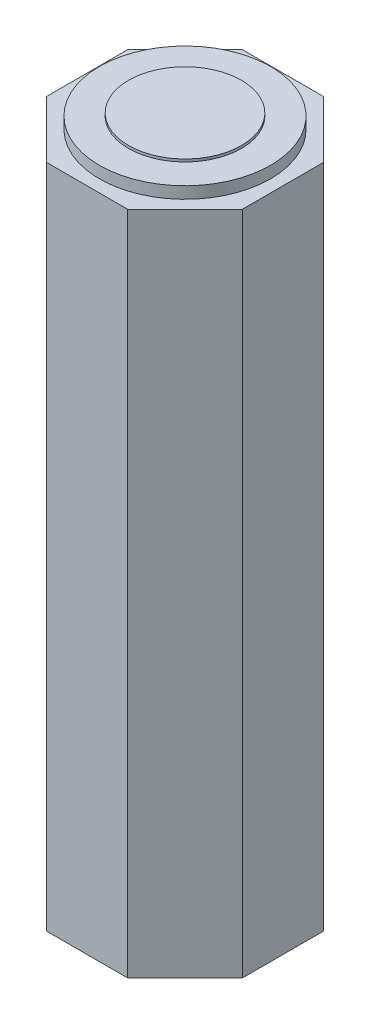
ISO-10303-21;
HEADER;
FILE_DESCRIPTION(('STEP AP214'),'2;1');
FILE_NAME('part.step','',(''),(''),'','','');
FILE_SCHEMA(('AUTOMOTIVE_DESIGN { 1 0 10303 214 1 1 1 1 }'));
ENDSEC;
DATA;
#1=APPLICATION_CONTEXT('core data for automotive mechanical design processes');
#2=APPLICATION_PROTOCOL_DEFINITION('international standard','automotive_design',2000,#1);
#3=PRODUCT_CONTEXT('',#1,'mechanical');
#4=PRODUCT('Part','Part','',(#3));
#5=PRODUCT_RELATED_PRODUCT_CATEGORY('part','',(#4));
#6=PRODUCT_DEFINITION_FORMATION('','',#4);
#7=PRODUCT_DEFINITION_CONTEXT('part definition',#1,'design');
#8=PRODUCT_DEFINITION('design','',#6,#7);
#9=PRODUCT_DEFINITION_SHAPE('','',#8);
#10=(LENGTH_UNIT() NAMED_UNIT(*) SI_UNIT(.MILLI.,.METRE.));
#11=(NAMED_UNIT(*) PLANE_ANGLE_UNIT() SI_UNIT($,.RADIAN.));
#12=(NAMED_UNIT(*) SI_UNIT($,.STERADIAN.) SOLID_ANGLE_UNIT());
#13=UNCERTAINTY_MEASURE_WITH_UNIT(LENGTH_MEASURE(1.E-05),#10,'distance_accuracy_value','');
#14=(GEOMETRIC_REPRESENTATION_CONTEXT(3) GLOBAL_UNCERTAINTY_ASSIGNED_CONTEXT((#13)) GLOBAL_UNIT_ASSIGNED_CONTEXT((#10,
#11,#12)) REPRESENTATION_CONTEXT('',''));
#15=CARTESIAN_POINT('',(0.,0.,0.));
#16=DIRECTION('',(0.,0.,1.));
#17=DIRECTION('',(1.,0.,0.));
#18=AXIS2_PLACEMENT_3D('',#15,#16,#17);
#19=CARTESIAN_POINT('',(850.,-323.,1050.));
#20=DIRECTION('',(0.,1.,0.));
#21=DIRECTION('',(-1.,0.,0.));
#22=AXIS2_PLACEMENT_3D('',#19,#20,#21);
#23=CYLINDRICAL_SURFACE('',#22,197.);
#24=CARTESIAN_POINT('',(850.,-225.,1050.));
#25=DIRECTION('',(0.,1.,0.));
#26=DIRECTION('',(-1.,0.,0.));
#27=AXIS2_PLACEMENT_3D('',#24,#25,#26);
#28=CIRCLE('',#27,197.);
#29=CARTESIAN_POINT('',(653.,-225.,1050.));
#30=VERTEX_POINT('',#29);
#31=EDGE_CURVE('E21',#30,#30,#28,.T.);
#32=ORIENTED_EDGE('',*,*,#31,.T.);
#33=EDGE_LOOP('',(#32));
#34=FACE_BOUND('',#33,.T.);
#35=CARTESIAN_POINT('',(850.,-198.,1050.));
#36=DIRECTION('',(0.,-1.,0.));
#37=DIRECTION('',(0.,0.,1.));
#38=AXIS2_PLACEMENT_3D('',#35,#36,#37);
#39=CIRCLE('',#38,197.);
#40=CARTESIAN_POINT('',(850.,-198.,1247.));
#41=VERTEX_POINT('',#40);
#42=EDGE_CURVE('E113',#41,#41,#39,.T.);
#43=ORIENTED_EDGE('',*,*,#42,.T.);
#44=EDGE_LOOP('',(#43));
#45=FACE_BOUND('',#44,.T.);
#46=ADVANCED_FACE('F17',(#34,#45),#23,.T.);
#47=CARTESIAN_POINT('',(850.,-198.,1050.));
#48=DIRECTION('',(0.,1.,0.));
#49=DIRECTION('',(-1.,0.,0.));
#50=AXIS2_PLACEMENT_3D('',#47,#48,#49);
#51=CYLINDRICAL_SURFACE('',#50,130.);
#52=CARTESIAN_POINT('',(850.,-198.,1050.));
#53=DIRECTION('',(0.,-1.,0.));
#54=DIRECTION('',(0.,0.,1.));
#55=AXIS2_PLACEMENT_3D('',#52,#53,#54);
#56=CIRCLE('',#55,130.);
#57=CARTESIAN_POINT('',(850.,-198.,1180.));
#58=VERTEX_POINT('',#57);
#59=EDGE_CURVE('E116',#58,#58,#56,.T.);
#60=ORIENTED_EDGE('',*,*,#59,.F.);
#61=EDGE_LOOP('',(#60));
#62=FACE_BOUND('',#61,.T.);
#63=CARTESIAN_POINT('',(850.,-192.,1050.));
#64=DIRECTION('',(0.,-1.,0.));
#65=DIRECTION('',(1.,0.,0.));
#66=AXIS2_PLACEMENT_3D('',#63,#64,#65);
#67=CIRCLE('',#66,130.);
#68=CARTESIAN_POINT('',(980.,-192.,1050.));
#69=VERTEX_POINT('',#68);
#70=EDGE_CURVE('E108',#69,#69,#67,.T.);
#71=ORIENTED_EDGE('',*,*,#70,.T.);
#72=EDGE_LOOP('',(#71));
#73=FACE_BOUND('',#72,.T.);
#74=ADVANCED_FACE('F185',(#62,#73),#51,.T.);
#75=CARTESIAN_POINT('',(850.,-198.,1050.));
#76=DIRECTION('',(0.,-1.,0.));
#77=DIRECTION('',(1.,0.,0.));
#78=AXIS2_PLACEMENT_3D('',#75,#76,#77);
#79=PLANE('',#78);
#80=ORIENTED_EDGE('',*,*,#59,.T.);
#81=EDGE_LOOP('',(#80));
#82=FACE_BOUND('',#81,.T.);
#83=ORIENTED_EDGE('',*,*,#42,.F.);
#84=EDGE_LOOP('',(#83));
#85=FACE_BOUND('',#84,.T.);
#86=ADVANCED_FACE('F191',(#82,#85),#79,.F.);
#87=CARTESIAN_POINT('',(850.,-192.,1050.));
#88=DIRECTION('',(0.,-1.,0.));
#89=DIRECTION('',(1.,0.,0.));
#90=AXIS2_PLACEMENT_3D('',#87,#88,#89);
#91=PLANE('',#90);
#92=ORIENTED_EDGE('',*,*,#70,.F.);
#93=EDGE_LOOP('',(#92));
#94=FACE_BOUND('',#93,.T.);
#95=ADVANCED_FACE('F196',(#94),#91,.F.);
#96=CARTESIAN_POINT('',(850.,-225.,1050.));
#97=DIRECTION('',(0.,1.,0.));
#98=DIRECTION('',(0.,0.,-1.));
#99=AXIS2_PLACEMENT_3D('',#96,#97,#98);
#100=PLANE('',#99);
#101=DIRECTION('',(0.,0.,1.));
#102=VECTOR('',#101,1.);
#103=CARTESIAN_POINT('',(1075.,-225.,956.801948466053));
#104=LINE('',#103,#102);
#105=CARTESIAN_POINT('',(1075.,-225.,956.801948466053));
#106=VERTEX_POINT('',#105);
#107=CARTESIAN_POINT('',(1075.,-225.,1143.19805153395));
#108=VERTEX_POINT('',#107);
#109=EDGE_CURVE('E86',#106,#108,#104,.T.);
#110=ORIENTED_EDGE('',*,*,#109,.F.);
#111=DIRECTION('',(0.707106781186548,0.,0.707106781186547));
#112=VECTOR('',#111,1.);
#113=CARTESIAN_POINT('',(943.198051533946,-225.,825.));
#114=LINE('',#113,#112);
#115=CARTESIAN_POINT('',(943.198051533946,-225.,825.));
#116=VERTEX_POINT('',#115);
#117=EDGE_CURVE('E93',#116,#106,#114,.T.);
#118=ORIENTED_EDGE('',*,*,#117,.F.);
#119=DIRECTION('',(1.,0.,0.));
#120=VECTOR('',#119,1.);
#121=CARTESIAN_POINT('',(756.801948466054,-225.,825.));
#122=LINE('',#121,#120);
#123=CARTESIAN_POINT('',(756.801948466054,-225.,825.));
#124=VERTEX_POINT('',#123);
#125=EDGE_CURVE('E98',#124,#116,#122,.T.);
#126=ORIENTED_EDGE('',*,*,#125,.F.);
#127=DIRECTION('',(0.707106781186547,0.,-0.707106781186548));
#128=VECTOR('',#127,1.);
#129=CARTESIAN_POINT('',(625.,-225.,956.801948466053));
#130=LINE('',#129,#128);
#131=CARTESIAN_POINT('',(625.,-225.,956.801948466053));
#132=VERTEX_POINT('',#131);
#133=EDGE_CURVE('E150',#132,#124,#130,.T.);
#134=ORIENTED_EDGE('',*,*,#133,.F.);
#135=DIRECTION('',(0.,0.,-1.));
#136=VECTOR('',#135,1.);
#137=CARTESIAN_POINT('',(625.,-225.,1143.19805153395));
#138=LINE('',#137,#136);
#139=CARTESIAN_POINT('',(625.,-225.,1143.19805153395));
#140=VERTEX_POINT('',#139);
#141=EDGE_CURVE('E167',#140,#132,#138,.T.);
#142=ORIENTED_EDGE('',*,*,#141,.F.);
#143=DIRECTION('',(-0.707106781186547,0.,-0.707106781186548));
#144=VECTOR('',#143,1.);
#145=CARTESIAN_POINT('',(756.801948466054,-225.,1275.));
#146=LINE('',#145,#144);
#147=CARTESIAN_POINT('',(756.801948466054,-225.,1275.));
#148=VERTEX_POINT('',#147);
#149=EDGE_CURVE('E165',#148,#140,#146,.T.);
#150=ORIENTED_EDGE('',*,*,#149,.F.);
#151=DIRECTION('',(-1.,0.,0.));
#152=VECTOR('',#151,1.);
#153=CARTESIAN_POINT('',(943.198051533946,-225.,1275.));
#154=LINE('',#153,#152);
#155=CARTESIAN_POINT('',(943.198051533946,-225.,1275.));
#156=VERTEX_POINT('',#155);
#157=EDGE_CURVE('E168',#156,#148,#154,.T.);
#158=ORIENTED_EDGE('',*,*,#157,.F.);
#159=DIRECTION('',(-0.707106781186549,0.,0.707106781186547));
#160=VECTOR('',#159,1.);
#161=CARTESIAN_POINT('',(1075.,-225.,1143.19805153395));
#162=LINE('',#161,#160);
#163=EDGE_CURVE('E105',#108,#156,#162,.T.);
#164=ORIENTED_EDGE('',*,*,#163,.F.);
#165=EDGE_LOOP('',(#110,#118,#126,#134,#142,#150,#158,#164));
#166=FACE_BOUND('',#165,.T.);
#167=ORIENTED_EDGE('',*,*,#31,.F.);
#168=EDGE_LOOP('',(#167));
#169=FACE_BOUND('',#168,.T.);
#170=ADVANCED_FACE('F101',(#166,#169),#100,.T.);
#171=CARTESIAN_POINT('',(850.,-1757.,1050.));
#172=DIRECTION('',(0.,-1.,0.));
#173=DIRECTION('',(1.,0.,0.));
#174=AXIS2_PLACEMENT_3D('',#171,#172,#173);
#175=PLANE('',#174);
#176=DIRECTION('',(-0.707106781186548,0.,-0.707106781186548));
#177=VECTOR('',#176,1.);
#178=CARTESIAN_POINT('',(1009.09902576697,-1757.,890.900974233027));
#179=LINE('',#178,#177);
#180=CARTESIAN_POINT('',(1075.,-1757.,956.801948466054));
#181=VERTEX_POINT('',#180);
#182=CARTESIAN_POINT('',(943.198051533946,-1757.,825.));
#183=VERTEX_POINT('',#182);
#184=EDGE_CURVE('E90',#181,#183,#179,.T.);
#185=ORIENTED_EDGE('',*,*,#184,.F.);
#186=DIRECTION('',(0.,0.,-1.));
#187=VECTOR('',#186,1.);
#188=CARTESIAN_POINT('',(1075.,-1757.,1050.));
#189=LINE('',#188,#187);
#190=CARTESIAN_POINT('',(1075.,-1757.,1143.19805153395));
#191=VERTEX_POINT('',#190);
#192=EDGE_CURVE('E88',#191,#181,#189,.T.);
#193=ORIENTED_EDGE('',*,*,#192,.F.);
#194=DIRECTION('',(0.707106781186548,0.,-0.707106781186547));
#195=VECTOR('',#194,1.);
#196=CARTESIAN_POINT('',(1009.09902576697,-1757.,1209.09902576697));
#197=LINE('',#196,#195);
#198=CARTESIAN_POINT('',(943.198051533946,-1757.,1275.));
#199=VERTEX_POINT('',#198);
#200=EDGE_CURVE('E41',#199,#191,#197,.T.);
#201=ORIENTED_EDGE('',*,*,#200,.F.);
#202=DIRECTION('',(1.,0.,0.));
#203=VECTOR('',#202,1.);
#204=CARTESIAN_POINT('',(850.,-1757.,1275.));
#205=LINE('',#204,#203);
#206=CARTESIAN_POINT('',(756.801948466054,-1757.,1275.));
#207=VERTEX_POINT('',#206);
#208=EDGE_CURVE('E127',#207,#199,#205,.T.);
#209=ORIENTED_EDGE('',*,*,#208,.F.);
#210=DIRECTION('',(0.707106781186548,0.,0.707106781186548));
#211=VECTOR('',#210,1.);
#212=CARTESIAN_POINT('',(690.900974233026,-1757.,1209.09902576697));
#213=LINE('',#212,#211);
#214=CARTESIAN_POINT('',(625.,-1757.,1143.19805153395));
#215=VERTEX_POINT('',#214);
#216=EDGE_CURVE('E125',#215,#207,#213,.T.);
#217=ORIENTED_EDGE('',*,*,#216,.F.);
#218=DIRECTION('',(0.,0.,1.));
#219=VECTOR('',#218,1.);
#220=CARTESIAN_POINT('',(625.,-1757.,1050.));
#221=LINE('',#220,#219);
#222=CARTESIAN_POINT('',(625.,-1757.,956.801948466053));
#223=VERTEX_POINT('',#222);
#224=EDGE_CURVE('E123',#223,#215,#221,.T.);
#225=ORIENTED_EDGE('',*,*,#224,.F.);
#226=DIRECTION('',(-0.707106781186548,0.,0.707106781186548));
#227=VECTOR('',#226,1.);
#228=CARTESIAN_POINT('',(690.900974233027,-1757.,890.900974233027));
#229=LINE('',#228,#227);
#230=CARTESIAN_POINT('',(756.801948466054,-1757.,825.));
#231=VERTEX_POINT('',#230);
#232=EDGE_CURVE('E121',#231,#223,#229,.T.);
#233=ORIENTED_EDGE('',*,*,#232,.F.);
#234=DIRECTION('',(-1.,0.,0.));
#235=VECTOR('',#234,1.);
#236=CARTESIAN_POINT('',(850.,-1757.,825.));
#237=LINE('',#236,#235);
#238=EDGE_CURVE('E89',#183,#231,#237,.T.);
#239=ORIENTED_EDGE('',*,*,#238,.F.);
#240=EDGE_LOOP('',(#185,#193,#201,#209,#217,#225,#233,#239));
#241=FACE_BOUND('',#240,.T.);
#242=ADVANCED_FACE('F19',(#241),#175,.T.);
#243=CARTESIAN_POINT('',(726.256313292354,-2046.28165430686,608.058261758408));
#244=DIRECTION('',(-0.707106781186548,0.,0.707106781186548));
#245=DIRECTION('',(-0.707106781186548,0.,-0.707106781186548));
#246=AXIS2_PLACEMENT_3D('',#243,#244,#245);
#247=PLANE('',#246);
#248=ORIENTED_EDGE('',*,*,#184,.T.);
#249=DIRECTION('',(0.,-1.,0.));
#250=VECTOR('',#249,1.);
#251=CARTESIAN_POINT('',(943.198051533946,-2046.3938302312,825.));
#252=LINE('',#251,#250);
#253=EDGE_CURVE('E11',#116,#183,#252,.T.);
#254=ORIENTED_EDGE('',*,*,#253,.F.);
#255=ORIENTED_EDGE('',*,*,#117,.T.);
#256=DIRECTION('',(0.,1.,0.));
#257=VECTOR('',#256,1.);
#258=CARTESIAN_POINT('',(1075.,-2061.92491000044,956.801948466054));
#259=LINE('',#258,#257);
#260=EDGE_CURVE('E33',#181,#106,#259,.T.);
#261=ORIENTED_EDGE('',*,*,#260,.F.);
#262=EDGE_LOOP('',(#248,#254,#255,#261));
#263=FACE_BOUND('',#262,.T.);
#264=ADVANCED_FACE('F94',(#263),#247,.F.);
#265=CARTESIAN_POINT('',(450.,-2046.3938302312,825.));
#266=DIRECTION('',(0.,0.,1.));
#267=DIRECTION('',(-1.,0.,0.));
#268=AXIS2_PLACEMENT_3D('',#265,#266,#267);
#269=PLANE('',#268);
#270=DIRECTION('',(0.,-1.,0.));
#271=VECTOR('',#270,1.);
#272=CARTESIAN_POINT('',(756.801948466054,-2046.28165430686,825.));
#273=LINE('',#272,#271);
#274=EDGE_CURVE('E26',#124,#231,#273,.T.);
#275=ORIENTED_EDGE('',*,*,#274,.F.);
#276=ORIENTED_EDGE('',*,*,#125,.T.);
#277=ORIENTED_EDGE('',*,*,#253,.T.);
#278=ORIENTED_EDGE('',*,*,#238,.T.);
#279=EDGE_LOOP('',(#275,#276,#277,#278));
#280=FACE_BOUND('',#279,.T.);
#281=ADVANCED_FACE('F174',(#280),#269,.F.);
#282=CARTESIAN_POINT('',(408.058261758407,-2046.28165430686,1173.74368670765));
#283=DIRECTION('',(0.707106781186548,0.,0.707106781186548));
#284=DIRECTION('',(-0.707106781186548,0.,0.707106781186548));
#285=AXIS2_PLACEMENT_3D('',#282,#283,#284);
#286=PLANE('',#285);
#287=DIRECTION('',(0.,-1.,0.));
#288=VECTOR('',#287,1.);
#289=CARTESIAN_POINT('',(625.,-2046.3938302312,956.801948466053));
#290=LINE('',#289,#288);
#291=EDGE_CURVE('E141',#132,#223,#290,.T.);
#292=ORIENTED_EDGE('',*,*,#291,.F.);
#293=ORIENTED_EDGE('',*,*,#133,.T.);
#294=ORIENTED_EDGE('',*,*,#274,.T.);
#295=ORIENTED_EDGE('',*,*,#232,.T.);
#296=EDGE_LOOP('',(#292,#293,#294,#295));
#297=FACE_BOUND('',#296,.T.);
#298=ADVANCED_FACE('F148',(#297),#286,.F.);
#299=CARTESIAN_POINT('',(625.,-2046.3938302312,1450.));
#300=DIRECTION('',(1.,0.,0.));
#301=DIRECTION('',(0.,0.,1.));
#302=AXIS2_PLACEMENT_3D('',#299,#300,#301);
#303=PLANE('',#302);
#304=DIRECTION('',(0.,-1.,0.));
#305=VECTOR('',#304,1.);
#306=CARTESIAN_POINT('',(625.,-2066.72303626914,1143.19805153395));
#307=LINE('',#306,#305);
#308=EDGE_CURVE('E138',#140,#215,#307,.T.);
#309=ORIENTED_EDGE('',*,*,#308,.F.);
#310=ORIENTED_EDGE('',*,*,#141,.T.);
#311=ORIENTED_EDGE('',*,*,#291,.T.);
#312=ORIENTED_EDGE('',*,*,#224,.T.);
#313=EDGE_LOOP('',(#309,#310,#311,#312));
#314=FACE_BOUND('',#313,.T.);
#315=ADVANCED_FACE('F158',(#314),#303,.F.);
#316=CARTESIAN_POINT('',(973.743686707646,-2066.72303626914,1491.94173824159));
#317=DIRECTION('',(0.707106781186548,0.,-0.707106781186548));
#318=DIRECTION('',(0.707106781186548,0.,0.707106781186548));
#319=AXIS2_PLACEMENT_3D('',#316,#317,#318);
#320=PLANE('',#319);
#321=DIRECTION('',(0.,-1.,0.));
#322=VECTOR('',#321,1.);
#323=CARTESIAN_POINT('',(756.801948466054,-2061.92491000044,1275.));
#324=LINE('',#323,#322);
#325=EDGE_CURVE('E135',#148,#207,#324,.T.);
#326=ORIENTED_EDGE('',*,*,#325,.F.);
#327=ORIENTED_EDGE('',*,*,#149,.T.);
#328=ORIENTED_EDGE('',*,*,#308,.T.);
#329=ORIENTED_EDGE('',*,*,#216,.T.);
#330=EDGE_LOOP('',(#326,#327,#328,#329));
#331=FACE_BOUND('',#330,.T.);
#332=ADVANCED_FACE('F163',(#331),#320,.F.);
#333=CARTESIAN_POINT('',(1250.,-2061.92491000044,1275.));
#334=DIRECTION('',(0.,0.,-1.));
#335=DIRECTION('',(1.,0.,0.));
#336=AXIS2_PLACEMENT_3D('',#333,#334,#335);
#337=PLANE('',#336);
#338=DIRECTION('',(0.,-1.,0.));
#339=VECTOR('',#338,1.);
#340=CARTESIAN_POINT('',(943.198051533946,-2086.92191119207,1275.));
#341=LINE('',#340,#339);
#342=EDGE_CURVE('E133',#156,#199,#341,.T.);
#343=ORIENTED_EDGE('',*,*,#342,.F.);
#344=ORIENTED_EDGE('',*,*,#157,.T.);
#345=ORIENTED_EDGE('',*,*,#325,.T.);
#346=ORIENTED_EDGE('',*,*,#208,.T.);
#347=EDGE_LOOP('',(#343,#344,#345,#346));
#348=FACE_BOUND('',#347,.T.);
#349=ADVANCED_FACE('F257',(#348),#337,.F.);
#350=CARTESIAN_POINT('',(1291.94173824159,-2086.92191119207,926.256313292354));
#351=DIRECTION('',(-0.707106781186547,0.,-0.707106781186548));
#352=DIRECTION('',(0.707106781186548,0.,-0.707106781186547));
#353=AXIS2_PLACEMENT_3D('',#350,#351,#352);
#354=PLANE('',#353);
#355=DIRECTION('',(0.,-1.,0.));
#356=VECTOR('',#355,1.);
#357=CARTESIAN_POINT('',(1075.,-2061.92491000044,1143.19805153395));
#358=LINE('',#357,#356);
#359=EDGE_CURVE('E131',#108,#191,#358,.T.);
#360=ORIENTED_EDGE('',*,*,#359,.F.);
#361=ORIENTED_EDGE('',*,*,#163,.T.);
#362=ORIENTED_EDGE('',*,*,#342,.T.);
#363=ORIENTED_EDGE('',*,*,#200,.T.);
#364=EDGE_LOOP('',(#360,#361,#362,#363));
#365=FACE_BOUND('',#364,.T.);
#366=ADVANCED_FACE('F267',(#365),#354,.F.);
#367=CARTESIAN_POINT('',(1075.,-2061.92491000044,650.));
#368=DIRECTION('',(-1.,0.,0.));
#369=DIRECTION('',(0.,0.,-1.));
#370=AXIS2_PLACEMENT_3D('',#367,#368,#369);
#371=PLANE('',#370);
#372=ORIENTED_EDGE('',*,*,#192,.T.);
#373=ORIENTED_EDGE('',*,*,#260,.T.);
#374=ORIENTED_EDGE('',*,*,#109,.T.);
#375=ORIENTED_EDGE('',*,*,#359,.T.);
#376=EDGE_LOOP('',(#372,#373,#374,#375));
#377=FACE_BOUND('',#376,.T.);
#378=ADVANCED_FACE('F84',(#377),#371,.F.);
#379=CLOSED_SHELL('',(#46,#74,#86,#95,#170,#242,#264,#281,#298,#315,#332,#349,#366,#378));
#380=MANIFOLD_SOLID_BREP('B1',#379);
#381=ADVANCED_BREP_SHAPE_REPRESENTATION('',(#18,#380),#14);
#382=SHAPE_DEFINITION_REPRESENTATION(#9,#381);
ENDSEC;
END-ISO-10303-21;
